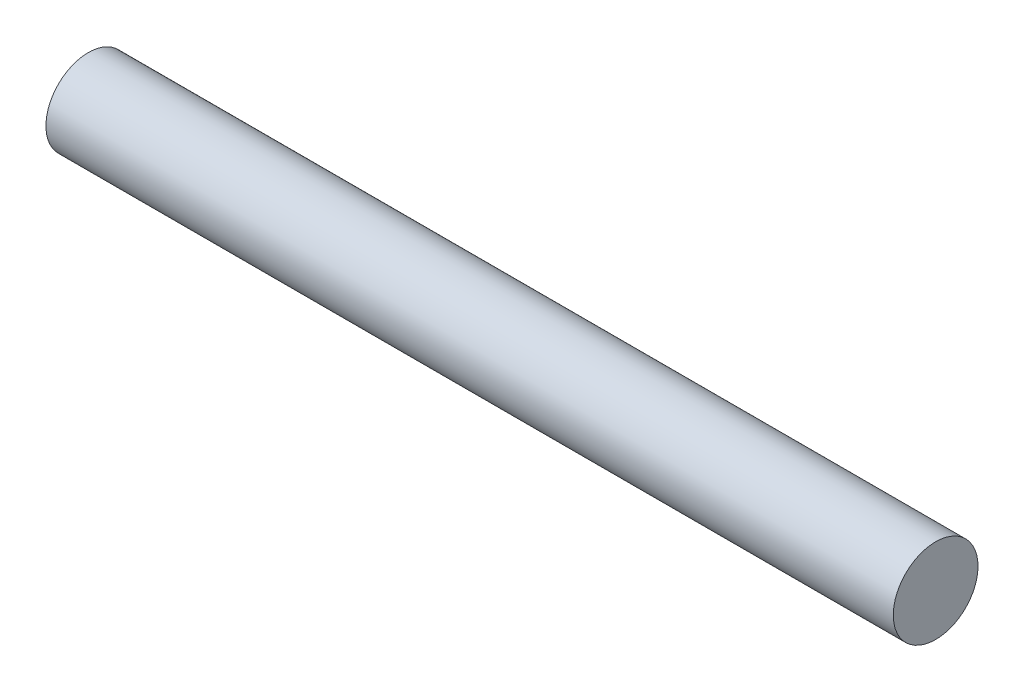
ISO-10303-21;
HEADER;
FILE_DESCRIPTION(('STEP AP214'),'2;1');
FILE_NAME('part.step','',(''),(''),'','','');
FILE_SCHEMA(('AUTOMOTIVE_DESIGN { 1 0 10303 214 1 1 1 1 }'));
ENDSEC;
DATA;
#1=APPLICATION_CONTEXT('core data for automotive mechanical design processes');
#2=APPLICATION_PROTOCOL_DEFINITION('international standard','automotive_design',2000,#1);
#3=PRODUCT_CONTEXT('',#1,'mechanical');
#4=PRODUCT('Part','Part','',(#3));
#5=PRODUCT_RELATED_PRODUCT_CATEGORY('part','',(#4));
#6=PRODUCT_DEFINITION_FORMATION('','',#4);
#7=PRODUCT_DEFINITION_CONTEXT('part definition',#1,'design');
#8=PRODUCT_DEFINITION('design','',#6,#7);
#9=PRODUCT_DEFINITION_SHAPE('','',#8);
#10=(LENGTH_UNIT() NAMED_UNIT(*) SI_UNIT(.MILLI.,.METRE.));
#11=(NAMED_UNIT(*) PLANE_ANGLE_UNIT() SI_UNIT($,.RADIAN.));
#12=(NAMED_UNIT(*) SI_UNIT($,.STERADIAN.) SOLID_ANGLE_UNIT());
#13=UNCERTAINTY_MEASURE_WITH_UNIT(LENGTH_MEASURE(1.E-05),#10,'distance_accuracy_value','');
#14=(GEOMETRIC_REPRESENTATION_CONTEXT(3) GLOBAL_UNCERTAINTY_ASSIGNED_CONTEXT((#13)) GLOBAL_UNIT_ASSIGNED_CONTEXT((#10,
#11,#12)) REPRESENTATION_CONTEXT('',''));
#15=CARTESIAN_POINT('',(0.,0.,0.));
#16=DIRECTION('',(0.,0.,1.));
#17=DIRECTION('',(1.,0.,0.));
#18=AXIS2_PLACEMENT_3D('',#15,#16,#17);
#19=CARTESIAN_POINT('',(30.,0.,0.));
#20=DIRECTION('',(-1.,0.,0.));
#21=DIRECTION('',(0.,0.,1.));
#22=AXIS2_PLACEMENT_3D('',#19,#20,#21);
#23=CYLINDRICAL_SURFACE('',#22,1.5);
#24=CARTESIAN_POINT('',(30.,0.,0.));
#25=DIRECTION('',(1.,0.,0.));
#26=DIRECTION('',(0.,0.,-1.));
#27=AXIS2_PLACEMENT_3D('',#24,#25,#26);
#28=CIRCLE('',#27,1.5);
#29=CARTESIAN_POINT('',(30.,0.,-1.5));
#30=VERTEX_POINT('',#29);
#31=EDGE_CURVE('E10',#30,#30,#28,.T.);
#32=ORIENTED_EDGE('',*,*,#31,.F.);
#33=EDGE_LOOP('',(#32));
#34=FACE_BOUND('',#33,.T.);
#35=CARTESIAN_POINT('',(0.,0.,0.));
#36=DIRECTION('',(1.,0.,0.));
#37=DIRECTION('',(0.,0.,-1.));
#38=AXIS2_PLACEMENT_3D('',#35,#36,#37);
#39=CIRCLE('',#38,1.5);
#40=CARTESIAN_POINT('',(0.,0.,-1.5));
#41=VERTEX_POINT('',#40);
#42=EDGE_CURVE('E36',#41,#41,#39,.T.);
#43=ORIENTED_EDGE('',*,*,#42,.T.);
#44=EDGE_LOOP('',(#43));
#45=FACE_BOUND('',#44,.T.);
#46=ADVANCED_FACE('F33',(#34,#45),#23,.T.);
#47=CARTESIAN_POINT('',(30.,0.,0.));
#48=DIRECTION('',(1.,0.,0.));
#49=DIRECTION('',(0.,0.,-1.));
#50=AXIS2_PLACEMENT_3D('',#47,#48,#49);
#51=PLANE('',#50);
#52=ORIENTED_EDGE('',*,*,#31,.T.);
#53=EDGE_LOOP('',(#52));
#54=FACE_BOUND('',#53,.T.);
#55=ADVANCED_FACE('F48',(#54),#51,.T.);
#56=CARTESIAN_POINT('',(0.,0.,0.));
#57=DIRECTION('',(1.,0.,0.));
#58=DIRECTION('',(0.,0.,-1.));
#59=AXIS2_PLACEMENT_3D('',#56,#57,#58);
#60=PLANE('',#59);
#61=ORIENTED_EDGE('',*,*,#42,.F.);
#62=EDGE_LOOP('',(#61));
#63=FACE_BOUND('',#62,.T.);
#64=ADVANCED_FACE('F46',(#63),#60,.F.);
#65=CLOSED_SHELL('',(#46,#55,#64));
#66=MANIFOLD_SOLID_BREP('B2',#65);
#67=ADVANCED_BREP_SHAPE_REPRESENTATION('',(#18,#66),#14);
#68=SHAPE_DEFINITION_REPRESENTATION(#9,#67);
ENDSEC;
END-ISO-10303-21;
